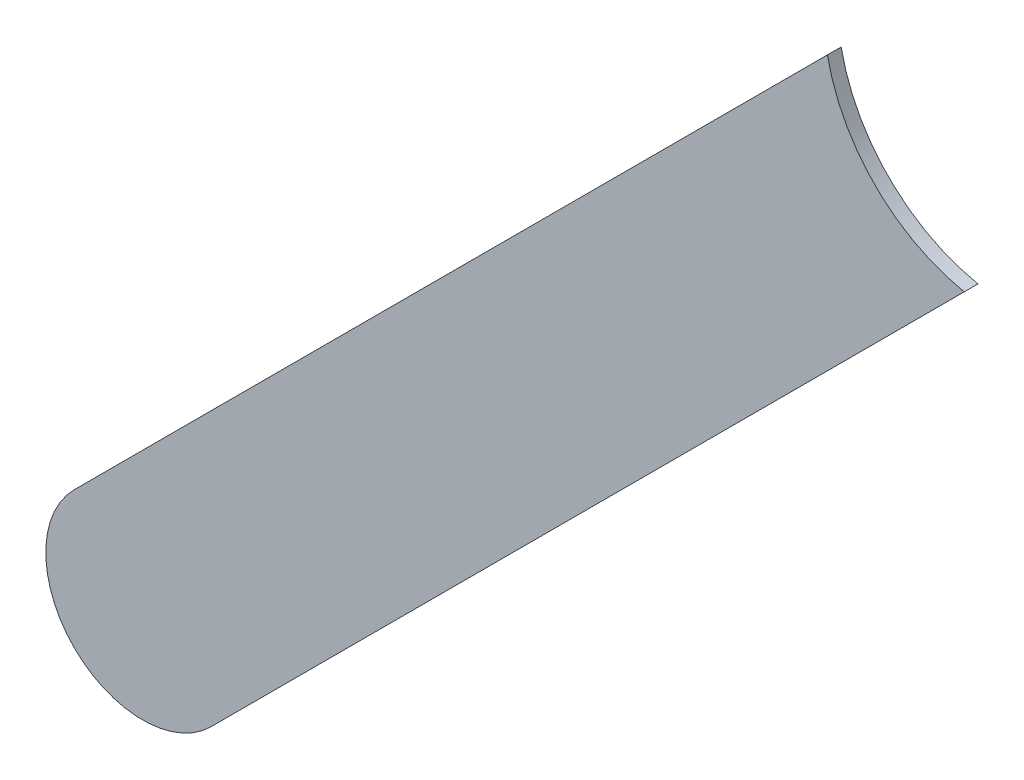
ISO-10303-21;
HEADER;
FILE_DESCRIPTION(('STEP AP214'),'2;1');
FILE_NAME('part.step','',(''),(''),'','','');
FILE_SCHEMA(('AUTOMOTIVE_DESIGN { 1 0 10303 214 1 1 1 1 }'));
ENDSEC;
DATA;
#1=APPLICATION_CONTEXT('core data for automotive mechanical design processes');
#2=APPLICATION_PROTOCOL_DEFINITION('international standard','automotive_design',2000,#1);
#3=PRODUCT_CONTEXT('',#1,'mechanical');
#4=PRODUCT('Part','Part','',(#3));
#5=PRODUCT_RELATED_PRODUCT_CATEGORY('part','',(#4));
#6=PRODUCT_DEFINITION_FORMATION('','',#4);
#7=PRODUCT_DEFINITION_CONTEXT('part definition',#1,'design');
#8=PRODUCT_DEFINITION('design','',#6,#7);
#9=PRODUCT_DEFINITION_SHAPE('','',#8);
#10=(LENGTH_UNIT() NAMED_UNIT(*) SI_UNIT(.MILLI.,.METRE.));
#11=(NAMED_UNIT(*) PLANE_ANGLE_UNIT() SI_UNIT($,.RADIAN.));
#12=(NAMED_UNIT(*) SI_UNIT($,.STERADIAN.) SOLID_ANGLE_UNIT());
#13=UNCERTAINTY_MEASURE_WITH_UNIT(LENGTH_MEASURE(1.E-05),#10,'distance_accuracy_value','');
#14=(GEOMETRIC_REPRESENTATION_CONTEXT(3) GLOBAL_UNCERTAINTY_ASSIGNED_CONTEXT((#13)) GLOBAL_UNIT_ASSIGNED_CONTEXT((#10,
#11,#12)) REPRESENTATION_CONTEXT('',''));
#15=CARTESIAN_POINT('',(0.,0.,0.));
#16=DIRECTION('',(0.,0.,1.));
#17=DIRECTION('',(1.,0.,0.));
#18=AXIS2_PLACEMENT_3D('',#15,#16,#17);
#19=CARTESIAN_POINT('',(46.07677602,96.86023046,0.));
#20=DIRECTION('',(-0.707106781186548,0.707106781186548,0.));
#21=DIRECTION('',(0.707106781186548,0.707106781186548,0.));
#22=AXIS2_PLACEMENT_3D('',#19,#20,#21);
#23=PLANE('',#22);
#24=DIRECTION('',(0.707106781186548,0.707106781186548,0.));
#25=VECTOR('',#24,1.);
#26=CARTESIAN_POINT('',(46.07677602,96.86023046,0.03556));
#27=LINE('',#26,#25);
#28=CARTESIAN_POINT('',(46.07677602,96.86023046,0.03556));
#29=VERTEX_POINT('',#28);
#30=CARTESIAN_POINT('',(48.0232054036052,98.8066598436052,0.03556));
#31=VERTEX_POINT('',#30);
#32=EDGE_CURVE('E11',#29,#31,#27,.T.);
#33=ORIENTED_EDGE('',*,*,#32,.F.);
#34=DIRECTION('',(0.,0.,1.));
#35=VECTOR('',#34,1.);
#36=CARTESIAN_POINT('',(46.07677602,96.86023046,0.));
#37=LINE('',#36,#35);
#38=CARTESIAN_POINT('',(46.07677602,96.86023046,0.));
#39=VERTEX_POINT('',#38);
#40=EDGE_CURVE('E24',#39,#29,#37,.T.);
#41=ORIENTED_EDGE('',*,*,#40,.F.);
#42=DIRECTION('',(0.707106781186548,0.707106781186548,0.));
#43=VECTOR('',#42,1.);
#44=CARTESIAN_POINT('',(46.07677602,96.86023046,0.));
#45=LINE('',#44,#43);
#46=CARTESIAN_POINT('',(48.0232054036052,98.8066598436052,0.));
#47=VERTEX_POINT('',#46);
#48=EDGE_CURVE('E75',#39,#47,#45,.T.);
#49=ORIENTED_EDGE('',*,*,#48,.T.);
#50=DIRECTION('',(0.,0.,1.));
#51=VECTOR('',#50,1.);
#52=CARTESIAN_POINT('',(48.0232054036052,98.8066598436052,0.));
#53=LINE('',#52,#51);
#54=EDGE_CURVE('E37',#47,#31,#53,.T.);
#55=ORIENTED_EDGE('',*,*,#54,.T.);
#56=EDGE_LOOP('',(#33,#41,#49,#55));
#57=FACE_BOUND('',#56,.T.);
#58=ADVANCED_FACE('F17',(#57),#23,.F.);
#59=CARTESIAN_POINT('',(48.1110036,99.2480108,0.));
#60=DIRECTION('',(0.,0.,-1.));
#61=DIRECTION('',(1.,0.,0.));
#62=AXIS2_PLACEMENT_3D('',#59,#60,#61);
#63=CYLINDRICAL_SURFACE('',#62,0.4499991);
#64=DIRECTION('',(0.,0.,1.));
#65=VECTOR('',#64,1.);
#66=CARTESIAN_POINT('',(47.6696526436052,99.1602126036052,0.));
#67=LINE('',#66,#65);
#68=CARTESIAN_POINT('',(47.6696526436052,99.1602126036052,0.));
#69=VERTEX_POINT('',#68);
#70=CARTESIAN_POINT('',(47.6696526436052,99.1602126036052,0.03556));
#71=VERTEX_POINT('',#70);
#72=EDGE_CURVE('E67',#69,#71,#67,.T.);
#73=ORIENTED_EDGE('',*,*,#72,.T.);
#74=CARTESIAN_POINT('',(48.1110036,99.2480108,0.03556));
#75=DIRECTION('',(0.,0.,1.));
#76=DIRECTION('',(1.,0.,0.));
#77=AXIS2_PLACEMENT_3D('',#74,#75,#76);
#78=CIRCLE('',#77,0.4499991);
#79=EDGE_CURVE('E82',#71,#31,#78,.T.);
#80=ORIENTED_EDGE('',*,*,#79,.T.);
#81=ORIENTED_EDGE('',*,*,#54,.F.);
#82=CARTESIAN_POINT('',(48.1110036,99.2480108,0.));
#83=DIRECTION('',(0.,0.,1.));
#84=DIRECTION('',(1.,0.,0.));
#85=AXIS2_PLACEMENT_3D('',#82,#83,#84);
#86=CIRCLE('',#85,0.4499991);
#87=EDGE_CURVE('E80',#69,#47,#86,.T.);
#88=ORIENTED_EDGE('',*,*,#87,.F.);
#89=EDGE_LOOP('',(#73,#80,#81,#88));
#90=FACE_BOUND('',#89,.T.);
#91=ADVANCED_FACE('F88',(#90),#63,.F.);
#92=CARTESIAN_POINT('',(47.6696526436052,99.1602126036052,0.));
#93=DIRECTION('',(0.707106781186546,-0.707106781186549,0.));
#94=DIRECTION('',(-0.707106781186549,-0.707106781186546,0.));
#95=AXIS2_PLACEMENT_3D('',#92,#93,#94);
#96=PLANE('',#95);
#97=DIRECTION('',(-0.707106781186549,-0.707106781186546,0.));
#98=VECTOR('',#97,1.);
#99=CARTESIAN_POINT('',(47.93422722,99.42478718,0.03556));
#100=LINE('',#99,#98);
#101=CARTESIAN_POINT('',(45.72322326,97.21378322,0.03556));
#102=VERTEX_POINT('',#101);
#103=EDGE_CURVE('E71',#71,#102,#100,.T.);
#104=ORIENTED_EDGE('',*,*,#103,.F.);
#105=ORIENTED_EDGE('',*,*,#72,.F.);
#106=DIRECTION('',(-0.707106781186549,-0.707106781186546,0.));
#107=VECTOR('',#106,1.);
#108=CARTESIAN_POINT('',(47.93422722,99.42478718,0.));
#109=LINE('',#108,#107);
#110=CARTESIAN_POINT('',(45.72322326,97.21378322,0.));
#111=VERTEX_POINT('',#110);
#112=EDGE_CURVE('E63',#69,#111,#109,.T.);
#113=ORIENTED_EDGE('',*,*,#112,.T.);
#114=DIRECTION('',(0.,0.,1.));
#115=VECTOR('',#114,1.);
#116=CARTESIAN_POINT('',(45.72322326,97.21378322,0.));
#117=LINE('',#116,#115);
#118=EDGE_CURVE('E53',#111,#102,#117,.T.);
#119=ORIENTED_EDGE('',*,*,#118,.T.);
#120=EDGE_LOOP('',(#104,#105,#113,#119));
#121=FACE_BOUND('',#120,.T.);
#122=ADVANCED_FACE('F66',(#121),#96,.F.);
#123=CARTESIAN_POINT('',(45.89999964,97.03700684,0.));
#124=DIRECTION('',(0.,0.,-1.));
#125=DIRECTION('',(-0.707106781186562,0.707106781186533,0.));
#126=AXIS2_PLACEMENT_3D('',#123,#124,#125);
#127=CYLINDRICAL_SURFACE('',#126,0.249999554103221);
#128=CARTESIAN_POINT('',(45.89999964,97.03700684,0.03556));
#129=DIRECTION('',(0.,0.,1.));
#130=DIRECTION('',(-0.707106781186562,0.707106781186533,0.));
#131=AXIS2_PLACEMENT_3D('',#128,#129,#130);
#132=CIRCLE('',#131,0.249999554103221);
#133=EDGE_CURVE('E59',#102,#29,#132,.T.);
#134=ORIENTED_EDGE('',*,*,#133,.F.);
#135=ORIENTED_EDGE('',*,*,#118,.F.);
#136=CARTESIAN_POINT('',(45.89999964,97.03700684,0.));
#137=DIRECTION('',(0.,0.,1.));
#138=DIRECTION('',(-0.707106781186562,0.707106781186533,0.));
#139=AXIS2_PLACEMENT_3D('',#136,#137,#138);
#140=CIRCLE('',#139,0.249999554103221);
#141=EDGE_CURVE('E57',#111,#39,#140,.T.);
#142=ORIENTED_EDGE('',*,*,#141,.T.);
#143=ORIENTED_EDGE('',*,*,#40,.T.);
#144=EDGE_LOOP('',(#134,#135,#142,#143));
#145=FACE_BOUND('',#144,.T.);
#146=ADVANCED_FACE('F55',(#145),#127,.T.);
#147=CARTESIAN_POINT('',(46.07677602,96.86023046,0.));
#148=DIRECTION('',(0.,0.,-1.));
#149=DIRECTION('',(-1.,0.,0.));
#150=AXIS2_PLACEMENT_3D('',#147,#148,#149);
#151=PLANE('',#150);
#152=ORIENTED_EDGE('',*,*,#48,.F.);
#153=ORIENTED_EDGE('',*,*,#141,.F.);
#154=ORIENTED_EDGE('',*,*,#112,.F.);
#155=ORIENTED_EDGE('',*,*,#87,.T.);
#156=EDGE_LOOP('',(#152,#153,#154,#155));
#157=FACE_BOUND('',#156,.T.);
#158=ADVANCED_FACE('F74',(#157),#151,.T.);
#159=CARTESIAN_POINT('',(46.07677602,96.86023046,0.03556));
#160=DIRECTION('',(0.,0.,-1.));
#161=DIRECTION('',(-1.,0.,0.));
#162=AXIS2_PLACEMENT_3D('',#159,#160,#161);
#163=PLANE('',#162);
#164=ORIENTED_EDGE('',*,*,#133,.T.);
#165=ORIENTED_EDGE('',*,*,#32,.T.);
#166=ORIENTED_EDGE('',*,*,#79,.F.);
#167=ORIENTED_EDGE('',*,*,#103,.T.);
#168=EDGE_LOOP('',(#164,#165,#166,#167));
#169=FACE_BOUND('',#168,.T.);
#170=ADVANCED_FACE('F91',(#169),#163,.F.);
#171=CLOSED_SHELL('',(#58,#91,#122,#146,#158,#170));
#172=MANIFOLD_SOLID_BREP('B1',#171);
#173=ADVANCED_BREP_SHAPE_REPRESENTATION('',(#18,#172),#14);
#174=SHAPE_DEFINITION_REPRESENTATION(#9,#173);
ENDSEC;
END-ISO-10303-21;
